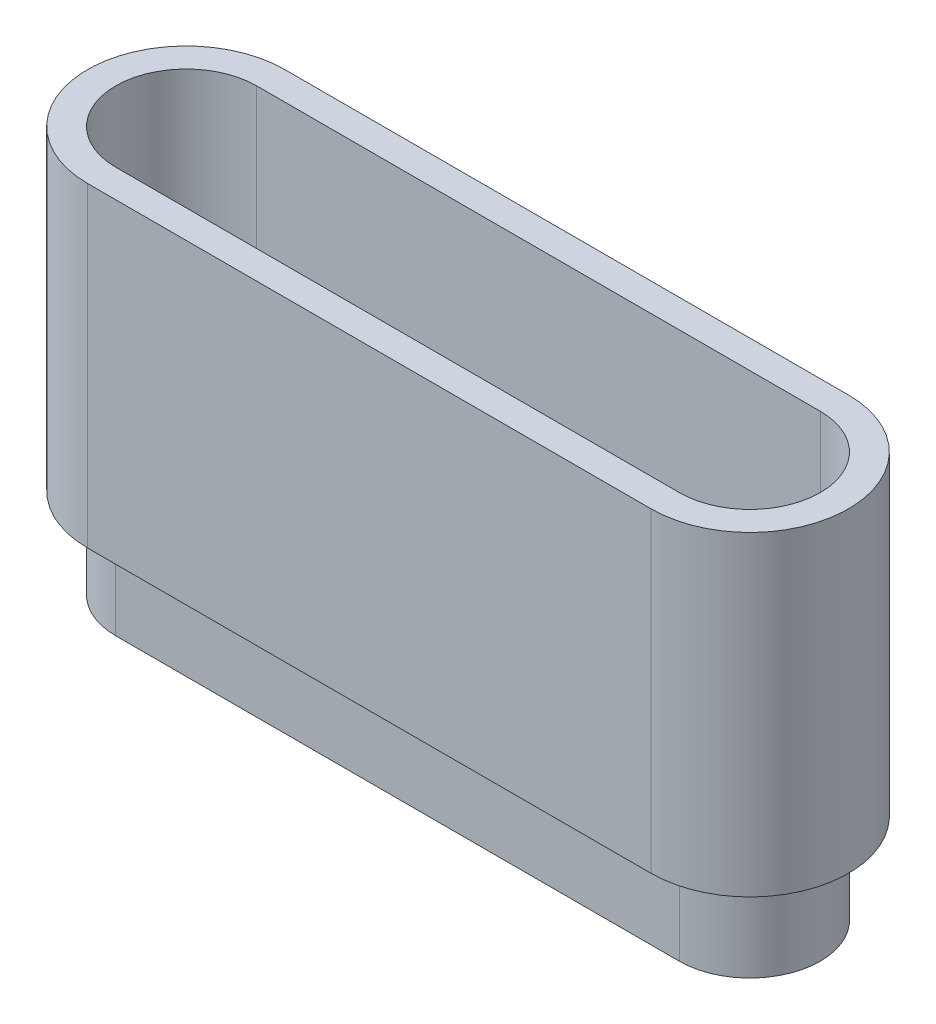
ISO-10303-21;
HEADER;
FILE_DESCRIPTION(('STEP AP214'),'2;1');
FILE_NAME('part.step','',(''),(''),'','','');
FILE_SCHEMA(('AUTOMOTIVE_DESIGN { 1 0 10303 214 1 1 1 1 }'));
ENDSEC;
DATA;
#1=APPLICATION_CONTEXT('core data for automotive mechanical design processes');
#2=APPLICATION_PROTOCOL_DEFINITION('international standard','automotive_design',2000,#1);
#3=PRODUCT_CONTEXT('',#1,'mechanical');
#4=PRODUCT('Part','Part','',(#3));
#5=PRODUCT_RELATED_PRODUCT_CATEGORY('part','',(#4));
#6=PRODUCT_DEFINITION_FORMATION('','',#4);
#7=PRODUCT_DEFINITION_CONTEXT('part definition',#1,'design');
#8=PRODUCT_DEFINITION('design','',#6,#7);
#9=PRODUCT_DEFINITION_SHAPE('','',#8);
#10=(LENGTH_UNIT() NAMED_UNIT(*) SI_UNIT(.MILLI.,.METRE.));
#11=(NAMED_UNIT(*) PLANE_ANGLE_UNIT() SI_UNIT($,.RADIAN.));
#12=(NAMED_UNIT(*) SI_UNIT($,.STERADIAN.) SOLID_ANGLE_UNIT());
#13=UNCERTAINTY_MEASURE_WITH_UNIT(LENGTH_MEASURE(1.E-05),#10,'distance_accuracy_value','');
#14=(GEOMETRIC_REPRESENTATION_CONTEXT(3) GLOBAL_UNCERTAINTY_ASSIGNED_CONTEXT((#13)) GLOBAL_UNIT_ASSIGNED_CONTEXT((#10,
#11,#12)) REPRESENTATION_CONTEXT('',''));
#15=CARTESIAN_POINT('',(0.,0.,0.));
#16=DIRECTION('',(0.,0.,1.));
#17=DIRECTION('',(1.,0.,0.));
#18=AXIS2_PLACEMENT_3D('',#15,#16,#17);
#19=CARTESIAN_POINT('',(0.,72.,0.));
#20=DIRECTION('',(0.,1.,0.));
#21=DIRECTION('',(0.,0.,1.));
#22=AXIS2_PLACEMENT_3D('',#19,#20,#21);
#23=PLANE('',#22);
#24=CARTESIAN_POINT('',(0.,72.,0.));
#25=DIRECTION('',(0.,1.,0.));
#26=DIRECTION('',(1.,0.,0.));
#27=AXIS2_PLACEMENT_3D('',#24,#25,#26);
#28=CIRCLE('',#27,17.5);
#29=CARTESIAN_POINT('',(0.,72.,-17.5));
#30=VERTEX_POINT('',#29);
#31=CARTESIAN_POINT('',(0.,72.,17.5));
#32=VERTEX_POINT('',#31);
#33=EDGE_CURVE('E189',#30,#32,#28,.T.);
#34=ORIENTED_EDGE('',*,*,#33,.T.);
#35=DIRECTION('',(1.,0.,0.));
#36=VECTOR('',#35,1.);
#37=CARTESIAN_POINT('',(0.,72.,17.5));
#38=LINE('',#37,#36);
#39=CARTESIAN_POINT('',(100.,72.,17.5));
#40=VERTEX_POINT('',#39);
#41=EDGE_CURVE('E193',#32,#40,#38,.T.);
#42=ORIENTED_EDGE('',*,*,#41,.T.);
#43=CARTESIAN_POINT('',(100.,72.,0.));
#44=DIRECTION('',(0.,1.,0.));
#45=DIRECTION('',(1.,0.,0.));
#46=AXIS2_PLACEMENT_3D('',#43,#44,#45);
#47=CIRCLE('',#46,17.5);
#48=CARTESIAN_POINT('',(100.,72.,-17.5));
#49=VERTEX_POINT('',#48);
#50=EDGE_CURVE('E197',#40,#49,#47,.T.);
#51=ORIENTED_EDGE('',*,*,#50,.T.);
#52=DIRECTION('',(-1.,0.,0.));
#53=VECTOR('',#52,1.);
#54=CARTESIAN_POINT('',(100.,72.,-17.5));
#55=LINE('',#54,#53);
#56=EDGE_CURVE('E200',#49,#30,#55,.T.);
#57=ORIENTED_EDGE('',*,*,#56,.T.);
#58=EDGE_LOOP('',(#34,#42,#51,#57));
#59=FACE_BOUND('',#58,.T.);
#60=DIRECTION('',(1.,0.,0.));
#61=VECTOR('',#60,1.);
#62=CARTESIAN_POINT('',(0.,72.,12.5));
#63=LINE('',#62,#61);
#64=CARTESIAN_POINT('',(0.,72.,12.5));
#65=VERTEX_POINT('',#64);
#66=CARTESIAN_POINT('',(100.,72.,12.5));
#67=VERTEX_POINT('',#66);
#68=EDGE_CURVE('E150',#65,#67,#63,.T.);
#69=ORIENTED_EDGE('',*,*,#68,.F.);
#70=CARTESIAN_POINT('',(0.,72.,0.));
#71=DIRECTION('',(0.,1.,0.));
#72=DIRECTION('',(0.,0.,1.));
#73=AXIS2_PLACEMENT_3D('',#70,#71,#72);
#74=CIRCLE('',#73,12.5);
#75=CARTESIAN_POINT('',(0.,72.,-12.5));
#76=VERTEX_POINT('',#75);
#77=EDGE_CURVE('E141',#76,#65,#74,.T.);
#78=ORIENTED_EDGE('',*,*,#77,.F.);
#79=DIRECTION('',(-1.,0.,0.));
#80=VECTOR('',#79,1.);
#81=CARTESIAN_POINT('',(100.,72.,-12.5));
#82=LINE('',#81,#80);
#83=CARTESIAN_POINT('',(100.,72.,-12.5));
#84=VERTEX_POINT('',#83);
#85=EDGE_CURVE('E167',#84,#76,#82,.T.);
#86=ORIENTED_EDGE('',*,*,#85,.F.);
#87=CARTESIAN_POINT('',(100.,72.,0.));
#88=DIRECTION('',(0.,1.,0.));
#89=DIRECTION('',(0.,0.,1.));
#90=AXIS2_PLACEMENT_3D('',#87,#88,#89);
#91=CIRCLE('',#90,12.5);
#92=EDGE_CURVE('E163',#67,#84,#91,.T.);
#93=ORIENTED_EDGE('',*,*,#92,.F.);
#94=EDGE_LOOP('',(#69,#78,#86,#93));
#95=FACE_BOUND('',#94,.T.);
#96=ADVANCED_FACE('F75',(#59,#95),#23,.T.);
#97=CARTESIAN_POINT('',(0.,16.,0.));
#98=DIRECTION('',(0.,1.,0.));
#99=DIRECTION('',(0.,0.,1.));
#100=AXIS2_PLACEMENT_3D('',#97,#98,#99);
#101=PLANE('',#100);
#102=CARTESIAN_POINT('',(0.,16.,0.));
#103=DIRECTION('',(0.,1.,0.));
#104=DIRECTION('',(1.,0.,0.));
#105=AXIS2_PLACEMENT_3D('',#102,#103,#104);
#106=CIRCLE('',#105,17.5);
#107=CARTESIAN_POINT('',(0.,16.,-17.5));
#108=VERTEX_POINT('',#107);
#109=CARTESIAN_POINT('',(0.,16.,17.5));
#110=VERTEX_POINT('',#109);
#111=EDGE_CURVE('E159',#108,#110,#106,.T.);
#112=ORIENTED_EDGE('',*,*,#111,.F.);
#113=DIRECTION('',(-1.,0.,0.));
#114=VECTOR('',#113,1.);
#115=CARTESIAN_POINT('',(100.,16.,-17.5));
#116=LINE('',#115,#114);
#117=CARTESIAN_POINT('',(100.,16.,-17.5));
#118=VERTEX_POINT('',#117);
#119=EDGE_CURVE('E194',#118,#108,#116,.T.);
#120=ORIENTED_EDGE('',*,*,#119,.F.);
#121=CARTESIAN_POINT('',(100.,16.,0.));
#122=DIRECTION('',(0.,1.,0.));
#123=DIRECTION('',(1.,0.,0.));
#124=AXIS2_PLACEMENT_3D('',#121,#122,#123);
#125=CIRCLE('',#124,17.5);
#126=CARTESIAN_POINT('',(100.,16.,17.5));
#127=VERTEX_POINT('',#126);
#128=EDGE_CURVE('E210',#127,#118,#125,.T.);
#129=ORIENTED_EDGE('',*,*,#128,.F.);
#130=DIRECTION('',(1.,0.,0.));
#131=VECTOR('',#130,1.);
#132=CARTESIAN_POINT('',(0.,16.,17.5));
#133=LINE('',#132,#131);
#134=EDGE_CURVE('E207',#110,#127,#133,.T.);
#135=ORIENTED_EDGE('',*,*,#134,.F.);
#136=EDGE_LOOP('',(#112,#120,#129,#135));
#137=FACE_BOUND('',#136,.T.);
#138=CARTESIAN_POINT('',(0.,16.,0.));
#139=DIRECTION('',(0.,1.,0.));
#140=DIRECTION('',(0.,0.,1.));
#141=AXIS2_PLACEMENT_3D('',#138,#139,#140);
#142=CIRCLE('',#141,12.5);
#143=CARTESIAN_POINT('',(0.,16.,-12.5));
#144=VERTEX_POINT('',#143);
#145=CARTESIAN_POINT('',(0.,16.,12.5));
#146=VERTEX_POINT('',#145);
#147=EDGE_CURVE('E99',#144,#146,#142,.T.);
#148=ORIENTED_EDGE('',*,*,#147,.T.);
#149=DIRECTION('',(1.,0.,0.));
#150=VECTOR('',#149,1.);
#151=CARTESIAN_POINT('',(0.,16.,12.5));
#152=LINE('',#151,#150);
#153=CARTESIAN_POINT('',(100.,16.,12.5));
#154=VERTEX_POINT('',#153);
#155=EDGE_CURVE('E157',#146,#154,#152,.T.);
#156=ORIENTED_EDGE('',*,*,#155,.T.);
#157=CARTESIAN_POINT('',(100.,16.,0.));
#158=DIRECTION('',(0.,1.,0.));
#159=DIRECTION('',(0.,0.,1.));
#160=AXIS2_PLACEMENT_3D('',#157,#158,#159);
#161=CIRCLE('',#160,12.5);
#162=CARTESIAN_POINT('',(100.,16.,-12.5));
#163=VERTEX_POINT('',#162);
#164=EDGE_CURVE('E176',#154,#163,#161,.T.);
#165=ORIENTED_EDGE('',*,*,#164,.T.);
#166=DIRECTION('',(-1.,0.,0.));
#167=VECTOR('',#166,1.);
#168=CARTESIAN_POINT('',(100.,16.,-12.5));
#169=LINE('',#168,#167);
#170=EDGE_CURVE('E151',#163,#144,#169,.T.);
#171=ORIENTED_EDGE('',*,*,#170,.T.);
#172=EDGE_LOOP('',(#148,#156,#165,#171));
#173=FACE_BOUND('',#172,.T.);
#174=ADVANCED_FACE('F233',(#137,#173),#101,.F.);
#175=CARTESIAN_POINT('',(0.,72.,0.));
#176=DIRECTION('',(0.,-1.,0.));
#177=DIRECTION('',(0.,0.,-1.));
#178=AXIS2_PLACEMENT_3D('',#175,#176,#177);
#179=CYLINDRICAL_SURFACE('',#178,17.5);
#180=ORIENTED_EDGE('',*,*,#111,.T.);
#181=DIRECTION('',(0.,-1.,0.));
#182=VECTOR('',#181,1.);
#183=CARTESIAN_POINT('',(0.,72.,17.5));
#184=LINE('',#183,#182);
#185=EDGE_CURVE('E13',#32,#110,#184,.T.);
#186=ORIENTED_EDGE('',*,*,#185,.F.);
#187=ORIENTED_EDGE('',*,*,#33,.F.);
#188=DIRECTION('',(0.,-1.,0.));
#189=VECTOR('',#188,1.);
#190=CARTESIAN_POINT('',(0.,72.,-17.5));
#191=LINE('',#190,#189);
#192=EDGE_CURVE('E203',#30,#108,#191,.T.);
#193=ORIENTED_EDGE('',*,*,#192,.T.);
#194=EDGE_LOOP('',(#180,#186,#187,#193));
#195=FACE_BOUND('',#194,.T.);
#196=ADVANCED_FACE('F77',(#195),#179,.T.);
#197=CARTESIAN_POINT('',(0.,72.,17.5));
#198=DIRECTION('',(0.,0.,-1.));
#199=DIRECTION('',(-1.,0.,0.));
#200=AXIS2_PLACEMENT_3D('',#197,#198,#199);
#201=PLANE('',#200);
#202=ORIENTED_EDGE('',*,*,#134,.T.);
#203=DIRECTION('',(0.,-1.,0.));
#204=VECTOR('',#203,1.);
#205=CARTESIAN_POINT('',(100.,72.,17.5));
#206=LINE('',#205,#204);
#207=EDGE_CURVE('E84',#40,#127,#206,.T.);
#208=ORIENTED_EDGE('',*,*,#207,.F.);
#209=ORIENTED_EDGE('',*,*,#41,.F.);
#210=ORIENTED_EDGE('',*,*,#185,.T.);
#211=EDGE_LOOP('',(#202,#208,#209,#210));
#212=FACE_BOUND('',#211,.T.);
#213=ADVANCED_FACE('F243',(#212),#201,.F.);
#214=CARTESIAN_POINT('',(100.,72.,0.));
#215=DIRECTION('',(0.,-1.,0.));
#216=DIRECTION('',(0.,0.,-1.));
#217=AXIS2_PLACEMENT_3D('',#214,#215,#216);
#218=CYLINDRICAL_SURFACE('',#217,17.5);
#219=ORIENTED_EDGE('',*,*,#128,.T.);
#220=DIRECTION('',(0.,-1.,0.));
#221=VECTOR('',#220,1.);
#222=CARTESIAN_POINT('',(100.,72.,-17.5));
#223=LINE('',#222,#221);
#224=EDGE_CURVE('E218',#49,#118,#223,.T.);
#225=ORIENTED_EDGE('',*,*,#224,.F.);
#226=ORIENTED_EDGE('',*,*,#50,.F.);
#227=ORIENTED_EDGE('',*,*,#207,.T.);
#228=EDGE_LOOP('',(#219,#225,#226,#227));
#229=FACE_BOUND('',#228,.T.);
#230=ADVANCED_FACE('F227',(#229),#218,.T.);
#231=CARTESIAN_POINT('',(100.,72.,-17.5));
#232=DIRECTION('',(0.,0.,1.));
#233=DIRECTION('',(1.,0.,0.));
#234=AXIS2_PLACEMENT_3D('',#231,#232,#233);
#235=PLANE('',#234);
#236=ORIENTED_EDGE('',*,*,#119,.T.);
#237=ORIENTED_EDGE('',*,*,#192,.F.);
#238=ORIENTED_EDGE('',*,*,#56,.F.);
#239=ORIENTED_EDGE('',*,*,#224,.T.);
#240=EDGE_LOOP('',(#236,#237,#238,#239));
#241=FACE_BOUND('',#240,.T.);
#242=ADVANCED_FACE('F237',(#241),#235,.F.);
#243=CARTESIAN_POINT('',(0.,72.,0.));
#244=DIRECTION('',(0.,-1.,0.));
#245=DIRECTION('',(0.,0.,-1.));
#246=AXIS2_PLACEMENT_3D('',#243,#244,#245);
#247=CYLINDRICAL_SURFACE('',#246,12.5);
#248=ORIENTED_EDGE('',*,*,#147,.F.);
#249=DIRECTION('',(0.,-1.,0.));
#250=VECTOR('',#249,1.);
#251=CARTESIAN_POINT('',(0.,72.,-12.5));
#252=LINE('',#251,#250);
#253=EDGE_CURVE('E145',#76,#144,#252,.T.);
#254=ORIENTED_EDGE('',*,*,#253,.F.);
#255=ORIENTED_EDGE('',*,*,#77,.T.);
#256=DIRECTION('',(0.,-1.,0.));
#257=VECTOR('',#256,1.);
#258=CARTESIAN_POINT('',(0.,72.,12.5));
#259=LINE('',#258,#257);
#260=EDGE_CURVE('E144',#65,#146,#259,.T.);
#261=ORIENTED_EDGE('',*,*,#260,.T.);
#262=EDGE_LOOP('',(#248,#254,#255,#261));
#263=FACE_BOUND('',#262,.T.);
#264=ADVANCED_FACE('F143',(#263),#247,.F.);
#265=CARTESIAN_POINT('',(0.,72.,12.5));
#266=DIRECTION('',(0.,0.,-1.));
#267=DIRECTION('',(-1.,0.,0.));
#268=AXIS2_PLACEMENT_3D('',#265,#266,#267);
#269=PLANE('',#268);
#270=ORIENTED_EDGE('',*,*,#155,.F.);
#271=ORIENTED_EDGE('',*,*,#260,.F.);
#272=ORIENTED_EDGE('',*,*,#68,.T.);
#273=DIRECTION('',(0.,-1.,0.));
#274=VECTOR('',#273,1.);
#275=CARTESIAN_POINT('',(100.,72.,12.5));
#276=LINE('',#275,#274);
#277=EDGE_CURVE('E160',#67,#154,#276,.T.);
#278=ORIENTED_EDGE('',*,*,#277,.T.);
#279=EDGE_LOOP('',(#270,#271,#272,#278));
#280=FACE_BOUND('',#279,.T.);
#281=ADVANCED_FACE('F154',(#280),#269,.T.);
#282=CARTESIAN_POINT('',(100.,72.,0.));
#283=DIRECTION('',(0.,-1.,0.));
#284=DIRECTION('',(0.,0.,-1.));
#285=AXIS2_PLACEMENT_3D('',#282,#283,#284);
#286=CYLINDRICAL_SURFACE('',#285,12.5);
#287=ORIENTED_EDGE('',*,*,#164,.F.);
#288=ORIENTED_EDGE('',*,*,#277,.F.);
#289=ORIENTED_EDGE('',*,*,#92,.T.);
#290=DIRECTION('',(0.,-1.,0.));
#291=VECTOR('',#290,1.);
#292=CARTESIAN_POINT('',(100.,72.,-12.5));
#293=LINE('',#292,#291);
#294=EDGE_CURVE('E91',#84,#163,#293,.T.);
#295=ORIENTED_EDGE('',*,*,#294,.T.);
#296=EDGE_LOOP('',(#287,#288,#289,#295));
#297=FACE_BOUND('',#296,.T.);
#298=ADVANCED_FACE('F266',(#297),#286,.F.);
#299=CARTESIAN_POINT('',(100.,72.,-12.5));
#300=DIRECTION('',(0.,0.,1.));
#301=DIRECTION('',(1.,0.,0.));
#302=AXIS2_PLACEMENT_3D('',#299,#300,#301);
#303=PLANE('',#302);
#304=ORIENTED_EDGE('',*,*,#170,.F.);
#305=ORIENTED_EDGE('',*,*,#294,.F.);
#306=ORIENTED_EDGE('',*,*,#85,.T.);
#307=ORIENTED_EDGE('',*,*,#253,.T.);
#308=EDGE_LOOP('',(#304,#305,#306,#307));
#309=FACE_BOUND('',#308,.T.);
#310=ADVANCED_FACE('F270',(#309),#303,.T.);
#311=CLOSED_SHELL('',(#96,#174,#196,#213,#230,#242,#264,#281,#298,#310));
#312=MANIFOLD_SOLID_BREP('B2',#311);
#313=CARTESIAN_POINT('',(0.,16.,0.));
#314=DIRECTION('',(0.,-1.,0.));
#315=DIRECTION('',(0.,0.,-1.));
#316=AXIS2_PLACEMENT_3D('',#313,#314,#315);
#317=CYLINDRICAL_SURFACE('',#316,12.5);
#318=CARTESIAN_POINT('',(0.,0.,0.));
#319=DIRECTION('',(0.,1.,0.));
#320=DIRECTION('',(0.,0.,1.));
#321=AXIS2_PLACEMENT_3D('',#318,#319,#320);
#322=CIRCLE('',#321,12.5);
#323=CARTESIAN_POINT('',(0.,0.,-12.5));
#324=VERTEX_POINT('',#323);
#325=CARTESIAN_POINT('',(0.,0.,12.5));
#326=VERTEX_POINT('',#325);
#327=EDGE_CURVE('E392',#324,#326,#322,.T.);
#328=ORIENTED_EDGE('',*,*,#327,.T.);
#329=DIRECTION('',(0.,-1.,0.));
#330=VECTOR('',#329,1.);
#331=CARTESIAN_POINT('',(0.,16.,12.5));
#332=LINE('',#331,#330);
#333=CARTESIAN_POINT('',(0.,16.,12.5));
#334=VERTEX_POINT('',#333);
#335=EDGE_CURVE('E73',#334,#326,#332,.T.);
#336=ORIENTED_EDGE('',*,*,#335,.F.);
#337=CARTESIAN_POINT('',(0.,16.,0.));
#338=DIRECTION('',(0.,1.,0.));
#339=DIRECTION('',(0.,0.,1.));
#340=AXIS2_PLACEMENT_3D('',#337,#338,#339);
#341=CIRCLE('',#340,12.5);
#342=CARTESIAN_POINT('',(0.,16.,-12.5));
#343=VERTEX_POINT('',#342);
#344=EDGE_CURVE('E378',#343,#334,#341,.T.);
#345=ORIENTED_EDGE('',*,*,#344,.F.);
#346=DIRECTION('',(0.,-1.,0.));
#347=VECTOR('',#346,1.);
#348=CARTESIAN_POINT('',(0.,16.,-12.5));
#349=LINE('',#348,#347);
#350=EDGE_CURVE('E345',#343,#324,#349,.T.);
#351=ORIENTED_EDGE('',*,*,#350,.T.);
#352=EDGE_LOOP('',(#328,#336,#345,#351));
#353=FACE_BOUND('',#352,.T.);
#354=ADVANCED_FACE('F329',(#353),#317,.T.);
#355=CARTESIAN_POINT('',(0.,16.,12.5));
#356=DIRECTION('',(0.,0.,-1.));
#357=DIRECTION('',(-1.,0.,0.));
#358=AXIS2_PLACEMENT_3D('',#355,#356,#357);
#359=PLANE('',#358);
#360=DIRECTION('',(1.,0.,0.));
#361=VECTOR('',#360,1.);
#362=CARTESIAN_POINT('',(0.,0.,12.5));
#363=LINE('',#362,#361);
#364=CARTESIAN_POINT('',(100.,0.,12.5));
#365=VERTEX_POINT('',#364);
#366=EDGE_CURVE('E383',#326,#365,#363,.T.);
#367=ORIENTED_EDGE('',*,*,#366,.T.);
#368=DIRECTION('',(0.,-1.,0.));
#369=VECTOR('',#368,1.);
#370=CARTESIAN_POINT('',(100.,16.,12.5));
#371=LINE('',#370,#369);
#372=CARTESIAN_POINT('',(100.,16.,12.5));
#373=VERTEX_POINT('',#372);
#374=EDGE_CURVE('E337',#373,#365,#371,.T.);
#375=ORIENTED_EDGE('',*,*,#374,.F.);
#376=DIRECTION('',(1.,0.,0.));
#377=VECTOR('',#376,1.);
#378=CARTESIAN_POINT('',(0.,16.,12.5));
#379=LINE('',#378,#377);
#380=EDGE_CURVE('E371',#334,#373,#379,.T.);
#381=ORIENTED_EDGE('',*,*,#380,.F.);
#382=ORIENTED_EDGE('',*,*,#335,.T.);
#383=EDGE_LOOP('',(#367,#375,#381,#382));
#384=FACE_BOUND('',#383,.T.);
#385=ADVANCED_FACE('F382',(#384),#359,.F.);
#386=CARTESIAN_POINT('',(100.,16.,0.));
#387=DIRECTION('',(0.,-1.,0.));
#388=DIRECTION('',(0.,0.,-1.));
#389=AXIS2_PLACEMENT_3D('',#386,#387,#388);
#390=CYLINDRICAL_SURFACE('',#389,12.5);
#391=CARTESIAN_POINT('',(100.,0.,0.));
#392=DIRECTION('',(0.,1.,0.));
#393=DIRECTION('',(0.,0.,1.));
#394=AXIS2_PLACEMENT_3D('',#391,#392,#393);
#395=CIRCLE('',#394,12.5);
#396=CARTESIAN_POINT('',(100.,0.,-12.5));
#397=VERTEX_POINT('',#396);
#398=EDGE_CURVE('E395',#365,#397,#395,.T.);
#399=ORIENTED_EDGE('',*,*,#398,.T.);
#400=DIRECTION('',(0.,-1.,0.));
#401=VECTOR('',#400,1.);
#402=CARTESIAN_POINT('',(100.,16.,-12.5));
#403=LINE('',#402,#401);
#404=CARTESIAN_POINT('',(100.,16.,-12.5));
#405=VERTEX_POINT('',#404);
#406=EDGE_CURVE('E360',#405,#397,#403,.T.);
#407=ORIENTED_EDGE('',*,*,#406,.F.);
#408=CARTESIAN_POINT('',(100.,16.,0.));
#409=DIRECTION('',(0.,1.,0.));
#410=DIRECTION('',(0.,0.,1.));
#411=AXIS2_PLACEMENT_3D('',#408,#409,#410);
#412=CIRCLE('',#411,12.5);
#413=EDGE_CURVE('E377',#373,#405,#412,.T.);
#414=ORIENTED_EDGE('',*,*,#413,.F.);
#415=ORIENTED_EDGE('',*,*,#374,.T.);
#416=EDGE_LOOP('',(#399,#407,#414,#415));
#417=FACE_BOUND('',#416,.T.);
#418=ADVANCED_FACE('F386',(#417),#390,.T.);
#419=CARTESIAN_POINT('',(0.,16.,-12.5));
#420=DIRECTION('',(0.,0.,-1.));
#421=DIRECTION('',(-1.,0.,0.));
#422=AXIS2_PLACEMENT_3D('',#419,#420,#421);
#423=PLANE('',#422);
#424=DIRECTION('',(1.,0.,0.));
#425=VECTOR('',#424,1.);
#426=CARTESIAN_POINT('',(0.,0.,-12.5));
#427=LINE('',#426,#425);
#428=EDGE_CURVE('E397',#324,#397,#427,.T.);
#429=ORIENTED_EDGE('',*,*,#428,.F.);
#430=ORIENTED_EDGE('',*,*,#350,.F.);
#431=DIRECTION('',(1.,0.,0.));
#432=VECTOR('',#431,1.);
#433=CARTESIAN_POINT('',(0.,16.,-12.5));
#434=LINE('',#433,#432);
#435=EDGE_CURVE('E387',#343,#405,#434,.T.);
#436=ORIENTED_EDGE('',*,*,#435,.T.);
#437=ORIENTED_EDGE('',*,*,#406,.T.);
#438=EDGE_LOOP('',(#429,#430,#436,#437));
#439=FACE_BOUND('',#438,.T.);
#440=ADVANCED_FACE('F403',(#439),#423,.T.);
#441=CARTESIAN_POINT('',(0.,16.,0.));
#442=DIRECTION('',(0.,1.,0.));
#443=DIRECTION('',(0.,0.,1.));
#444=AXIS2_PLACEMENT_3D('',#441,#442,#443);
#445=PLANE('',#444);
#446=ORIENTED_EDGE('',*,*,#344,.T.);
#447=ORIENTED_EDGE('',*,*,#380,.T.);
#448=ORIENTED_EDGE('',*,*,#413,.T.);
#449=ORIENTED_EDGE('',*,*,#435,.F.);
#450=EDGE_LOOP('',(#446,#447,#448,#449));
#451=FACE_BOUND('',#450,.T.);
#452=ADVANCED_FACE('F374',(#451),#445,.T.);
#453=CARTESIAN_POINT('',(0.,0.,0.));
#454=DIRECTION('',(0.,1.,0.));
#455=DIRECTION('',(0.,0.,1.));
#456=AXIS2_PLACEMENT_3D('',#453,#454,#455);
#457=PLANE('',#456);
#458=ORIENTED_EDGE('',*,*,#327,.F.);
#459=ORIENTED_EDGE('',*,*,#428,.T.);
#460=ORIENTED_EDGE('',*,*,#398,.F.);
#461=ORIENTED_EDGE('',*,*,#366,.F.);
#462=EDGE_LOOP('',(#458,#459,#460,#461));
#463=FACE_BOUND('',#462,.T.);
#464=ADVANCED_FACE('F402',(#463),#457,.F.);
#465=CLOSED_SHELL('',(#354,#385,#418,#440,#452,#464));
#466=MANIFOLD_SOLID_BREP('B7_NOT_SHOWN',#465);
#467=ADVANCED_BREP_SHAPE_REPRESENTATION('',(#18,#312,#466),#14);
#468=SHAPE_DEFINITION_REPRESENTATION(#9,#467);
ENDSEC;
END-ISO-10303-21;
